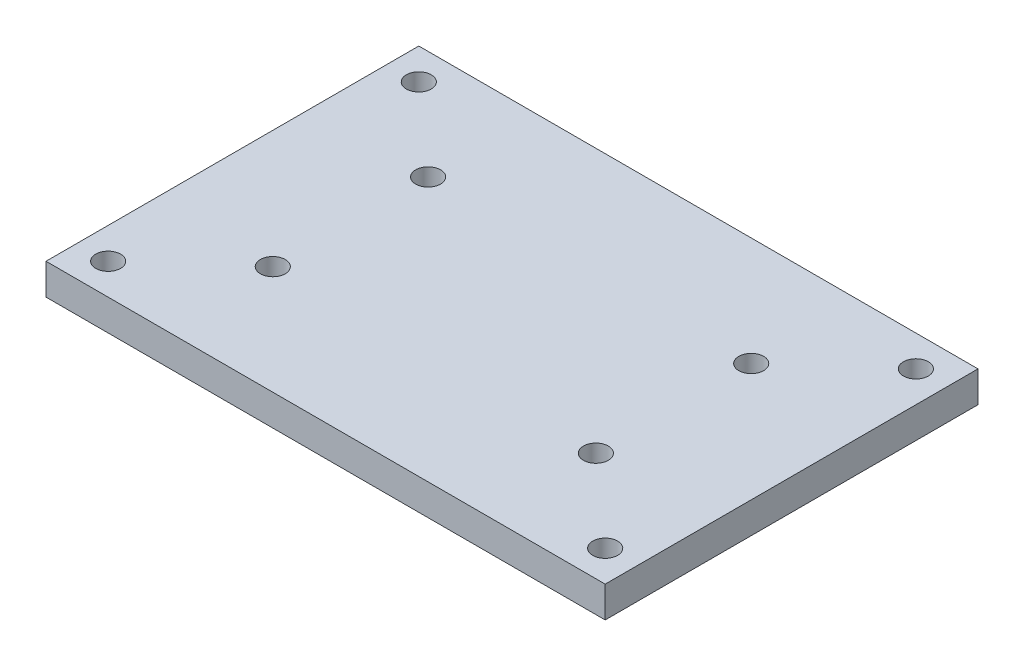
ISO-10303-21;
HEADER;
FILE_DESCRIPTION(('STEP AP214'),'2;1');
FILE_NAME('part.step','',(''),(''),'','','');
FILE_SCHEMA(('AUTOMOTIVE_DESIGN { 1 0 10303 214 1 1 1 1 }'));
ENDSEC;
DATA;
#1=APPLICATION_CONTEXT('core data for automotive mechanical design processes');
#2=APPLICATION_PROTOCOL_DEFINITION('international standard','automotive_design',2000,#1);
#3=PRODUCT_CONTEXT('',#1,'mechanical');
#4=PRODUCT('Part','Part','',(#3));
#5=PRODUCT_RELATED_PRODUCT_CATEGORY('part','',(#4));
#6=PRODUCT_DEFINITION_FORMATION('','',#4);
#7=PRODUCT_DEFINITION_CONTEXT('part definition',#1,'design');
#8=PRODUCT_DEFINITION('design','',#6,#7);
#9=PRODUCT_DEFINITION_SHAPE('','',#8);
#10=(LENGTH_UNIT() NAMED_UNIT(*) SI_UNIT(.MILLI.,.METRE.));
#11=(NAMED_UNIT(*) PLANE_ANGLE_UNIT() SI_UNIT($,.RADIAN.));
#12=(NAMED_UNIT(*) SI_UNIT($,.STERADIAN.) SOLID_ANGLE_UNIT());
#13=UNCERTAINTY_MEASURE_WITH_UNIT(LENGTH_MEASURE(1.E-05),#10,'distance_accuracy_value','');
#14=(GEOMETRIC_REPRESENTATION_CONTEXT(3) GLOBAL_UNCERTAINTY_ASSIGNED_CONTEXT((#13)) GLOBAL_UNIT_ASSIGNED_CONTEXT((#10,
#11,#12)) REPRESENTATION_CONTEXT('',''));
#15=CARTESIAN_POINT('',(0.,0.,0.));
#16=DIRECTION('',(0.,0.,1.));
#17=DIRECTION('',(1.,0.,0.));
#18=AXIS2_PLACEMENT_3D('',#15,#16,#17);
#19=CARTESIAN_POINT('',(0.,5.,0.));
#20=DIRECTION('',(0.,1.,0.));
#21=DIRECTION('',(0.,0.,1.));
#22=AXIS2_PLACEMENT_3D('',#19,#20,#21);
#23=PLANE('',#22);
#24=CARTESIAN_POINT('',(26.,5.,12.5));
#25=DIRECTION('',(0.,1.,0.));
#26=DIRECTION('',(0.,0.,1.));
#27=AXIS2_PLACEMENT_3D('',#24,#25,#26);
#28=CIRCLE('',#27,2.);
#29=CARTESIAN_POINT('',(26.,5.,14.5));
#30=VERTEX_POINT('',#29);
#31=EDGE_CURVE('E148',#30,#30,#28,.T.);
#32=ORIENTED_EDGE('',*,*,#31,.F.);
#33=EDGE_LOOP('',(#32));
#34=FACE_BOUND('',#33,.T.);
#35=CARTESIAN_POINT('',(-26.,5.,-12.5));
#36=DIRECTION('',(0.,1.,0.));
#37=DIRECTION('',(0.,0.,1.));
#38=AXIS2_PLACEMENT_3D('',#35,#36,#37);
#39=CIRCLE('',#38,2.);
#40=CARTESIAN_POINT('',(-26.,5.,-10.5));
#41=VERTEX_POINT('',#40);
#42=EDGE_CURVE('E136',#41,#41,#39,.T.);
#43=ORIENTED_EDGE('',*,*,#42,.F.);
#44=EDGE_LOOP('',(#43));
#45=FACE_BOUND('',#44,.T.);
#46=CARTESIAN_POINT('',(40.,5.,25.));
#47=DIRECTION('',(0.,1.,0.));
#48=DIRECTION('',(0.,0.,-1.));
#49=AXIS2_PLACEMENT_3D('',#46,#47,#48);
#50=CIRCLE('',#49,2.);
#51=CARTESIAN_POINT('',(40.,5.,23.));
#52=VERTEX_POINT('',#51);
#53=EDGE_CURVE('E124',#52,#52,#50,.T.);
#54=ORIENTED_EDGE('',*,*,#53,.F.);
#55=EDGE_LOOP('',(#54));
#56=FACE_BOUND('',#55,.T.);
#57=CARTESIAN_POINT('',(-40.,5.,-25.));
#58=DIRECTION('',(0.,1.,0.));
#59=DIRECTION('',(0.,0.,1.));
#60=AXIS2_PLACEMENT_3D('',#57,#58,#59);
#61=CIRCLE('',#60,2.);
#62=CARTESIAN_POINT('',(-40.,5.,-23.));
#63=VERTEX_POINT('',#62);
#64=EDGE_CURVE('E103',#63,#63,#61,.T.);
#65=ORIENTED_EDGE('',*,*,#64,.F.);
#66=EDGE_LOOP('',(#65));
#67=FACE_BOUND('',#66,.T.);
#68=DIRECTION('',(0.,0.,1.));
#69=VECTOR('',#68,1.);
#70=CARTESIAN_POINT('',(-45.,5.,30.));
#71=LINE('',#70,#69);
#72=CARTESIAN_POINT('',(-45.,5.,-30.));
#73=VERTEX_POINT('',#72);
#74=CARTESIAN_POINT('',(-45.,5.,30.));
#75=VERTEX_POINT('',#74);
#76=EDGE_CURVE('E88',#73,#75,#71,.T.);
#77=ORIENTED_EDGE('',*,*,#76,.T.);
#78=DIRECTION('',(1.,0.,0.));
#79=VECTOR('',#78,1.);
#80=CARTESIAN_POINT('',(45.,5.,30.));
#81=LINE('',#80,#79);
#82=CARTESIAN_POINT('',(45.,5.,30.));
#83=VERTEX_POINT('',#82);
#84=EDGE_CURVE('E83',#75,#83,#81,.T.);
#85=ORIENTED_EDGE('',*,*,#84,.T.);
#86=DIRECTION('',(0.,0.,-1.));
#87=VECTOR('',#86,1.);
#88=CARTESIAN_POINT('',(45.,5.,30.));
#89=LINE('',#88,#87);
#90=CARTESIAN_POINT('',(45.,5.,-30.));
#91=VERTEX_POINT('',#90);
#92=EDGE_CURVE('E86',#83,#91,#89,.T.);
#93=ORIENTED_EDGE('',*,*,#92,.T.);
#94=DIRECTION('',(-1.,0.,0.));
#95=VECTOR('',#94,1.);
#96=CARTESIAN_POINT('',(45.,5.,-30.));
#97=LINE('',#96,#95);
#98=EDGE_CURVE('E53',#91,#73,#97,.T.);
#99=ORIENTED_EDGE('',*,*,#98,.T.);
#100=EDGE_LOOP('',(#77,#85,#93,#99));
#101=FACE_BOUND('',#100,.T.);
#102=CARTESIAN_POINT('',(40.,5.,-25.));
#103=DIRECTION('',(0.,1.,0.));
#104=DIRECTION('',(0.,0.,1.));
#105=AXIS2_PLACEMENT_3D('',#102,#103,#104);
#106=CIRCLE('',#105,2.);
#107=CARTESIAN_POINT('',(40.,5.,-23.));
#108=VERTEX_POINT('',#107);
#109=EDGE_CURVE('E118',#108,#108,#106,.T.);
#110=ORIENTED_EDGE('',*,*,#109,.F.);
#111=EDGE_LOOP('',(#110));
#112=FACE_BOUND('',#111,.T.);
#113=CARTESIAN_POINT('',(-40.,5.,25.));
#114=DIRECTION('',(0.,1.,0.));
#115=DIRECTION('',(0.,0.,-1.));
#116=AXIS2_PLACEMENT_3D('',#113,#114,#115);
#117=CIRCLE('',#116,2.);
#118=CARTESIAN_POINT('',(-40.,5.,23.));
#119=VERTEX_POINT('',#118);
#120=EDGE_CURVE('E130',#119,#119,#117,.T.);
#121=ORIENTED_EDGE('',*,*,#120,.F.);
#122=EDGE_LOOP('',(#121));
#123=FACE_BOUND('',#122,.T.);
#124=CARTESIAN_POINT('',(26.,5.,-12.5));
#125=DIRECTION('',(0.,1.,0.));
#126=DIRECTION('',(0.,0.,-1.));
#127=AXIS2_PLACEMENT_3D('',#124,#125,#126);
#128=CIRCLE('',#127,2.);
#129=CARTESIAN_POINT('',(26.,5.,-14.5));
#130=VERTEX_POINT('',#129);
#131=EDGE_CURVE('E142',#130,#130,#128,.T.);
#132=ORIENTED_EDGE('',*,*,#131,.F.);
#133=EDGE_LOOP('',(#132));
#134=FACE_BOUND('',#133,.T.);
#135=CARTESIAN_POINT('',(-26.,5.,12.5));
#136=DIRECTION('',(0.,1.,0.));
#137=DIRECTION('',(0.,0.,-1.));
#138=AXIS2_PLACEMENT_3D('',#135,#136,#137);
#139=CIRCLE('',#138,2.);
#140=CARTESIAN_POINT('',(-26.,5.,10.5));
#141=VERTEX_POINT('',#140);
#142=EDGE_CURVE('E154',#141,#141,#139,.T.);
#143=ORIENTED_EDGE('',*,*,#142,.F.);
#144=EDGE_LOOP('',(#143));
#145=FACE_BOUND('',#144,.T.);
#146=ADVANCED_FACE('F36',(#34,#45,#56,#67,#101,#112,#123,#134,#145),#23,.T.);
#147=CARTESIAN_POINT('',(0.,0.,0.));
#148=DIRECTION('',(0.,1.,0.));
#149=DIRECTION('',(0.,0.,1.));
#150=AXIS2_PLACEMENT_3D('',#147,#148,#149);
#151=PLANE('',#150);
#152=DIRECTION('',(0.,0.,1.));
#153=VECTOR('',#152,1.);
#154=CARTESIAN_POINT('',(-45.,0.,30.));
#155=LINE('',#154,#153);
#156=CARTESIAN_POINT('',(-45.,0.,-30.));
#157=VERTEX_POINT('',#156);
#158=CARTESIAN_POINT('',(-45.,0.,30.));
#159=VERTEX_POINT('',#158);
#160=EDGE_CURVE('E100',#157,#159,#155,.T.);
#161=ORIENTED_EDGE('',*,*,#160,.F.);
#162=DIRECTION('',(-1.,0.,0.));
#163=VECTOR('',#162,1.);
#164=CARTESIAN_POINT('',(45.,0.,-30.));
#165=LINE('',#164,#163);
#166=CARTESIAN_POINT('',(45.,0.,-30.));
#167=VERTEX_POINT('',#166);
#168=EDGE_CURVE('E76',#167,#157,#165,.T.);
#169=ORIENTED_EDGE('',*,*,#168,.F.);
#170=DIRECTION('',(0.,0.,-1.));
#171=VECTOR('',#170,1.);
#172=CARTESIAN_POINT('',(45.,0.,30.));
#173=LINE('',#172,#171);
#174=CARTESIAN_POINT('',(45.,0.,30.));
#175=VERTEX_POINT('',#174);
#176=EDGE_CURVE('E70',#175,#167,#173,.T.);
#177=ORIENTED_EDGE('',*,*,#176,.F.);
#178=DIRECTION('',(1.,0.,0.));
#179=VECTOR('',#178,1.);
#180=CARTESIAN_POINT('',(45.,0.,30.));
#181=LINE('',#180,#179);
#182=EDGE_CURVE('E92',#159,#175,#181,.T.);
#183=ORIENTED_EDGE('',*,*,#182,.F.);
#184=EDGE_LOOP('',(#161,#169,#177,#183));
#185=FACE_BOUND('',#184,.T.);
#186=CARTESIAN_POINT('',(-40.,0.,-25.));
#187=DIRECTION('',(0.,1.,0.));
#188=DIRECTION('',(0.,0.,1.));
#189=AXIS2_PLACEMENT_3D('',#186,#187,#188);
#190=CIRCLE('',#189,2.);
#191=CARTESIAN_POINT('',(-40.,0.,-23.));
#192=VERTEX_POINT('',#191);
#193=EDGE_CURVE('E115',#192,#192,#190,.T.);
#194=ORIENTED_EDGE('',*,*,#193,.T.);
#195=EDGE_LOOP('',(#194));
#196=FACE_BOUND('',#195,.T.);
#197=CARTESIAN_POINT('',(40.,0.,-25.));
#198=DIRECTION('',(0.,1.,0.));
#199=DIRECTION('',(0.,0.,1.));
#200=AXIS2_PLACEMENT_3D('',#197,#198,#199);
#201=CIRCLE('',#200,2.);
#202=CARTESIAN_POINT('',(40.,0.,-23.));
#203=VERTEX_POINT('',#202);
#204=EDGE_CURVE('E121',#203,#203,#201,.T.);
#205=ORIENTED_EDGE('',*,*,#204,.T.);
#206=EDGE_LOOP('',(#205));
#207=FACE_BOUND('',#206,.T.);
#208=CARTESIAN_POINT('',(40.,0.,25.));
#209=DIRECTION('',(0.,1.,0.));
#210=DIRECTION('',(0.,0.,-1.));
#211=AXIS2_PLACEMENT_3D('',#208,#209,#210);
#212=CIRCLE('',#211,2.);
#213=CARTESIAN_POINT('',(40.,0.,23.));
#214=VERTEX_POINT('',#213);
#215=EDGE_CURVE('E127',#214,#214,#212,.T.);
#216=ORIENTED_EDGE('',*,*,#215,.T.);
#217=EDGE_LOOP('',(#216));
#218=FACE_BOUND('',#217,.T.);
#219=CARTESIAN_POINT('',(-40.,0.,25.));
#220=DIRECTION('',(0.,1.,0.));
#221=DIRECTION('',(0.,0.,-1.));
#222=AXIS2_PLACEMENT_3D('',#219,#220,#221);
#223=CIRCLE('',#222,2.);
#224=CARTESIAN_POINT('',(-40.,0.,23.));
#225=VERTEX_POINT('',#224);
#226=EDGE_CURVE('E133',#225,#225,#223,.T.);
#227=ORIENTED_EDGE('',*,*,#226,.T.);
#228=EDGE_LOOP('',(#227));
#229=FACE_BOUND('',#228,.T.);
#230=CARTESIAN_POINT('',(-26.,0.,-12.5));
#231=DIRECTION('',(0.,1.,0.));
#232=DIRECTION('',(0.,0.,1.));
#233=AXIS2_PLACEMENT_3D('',#230,#231,#232);
#234=CIRCLE('',#233,2.);
#235=CARTESIAN_POINT('',(-26.,0.,-10.5));
#236=VERTEX_POINT('',#235);
#237=EDGE_CURVE('E139',#236,#236,#234,.T.);
#238=ORIENTED_EDGE('',*,*,#237,.T.);
#239=EDGE_LOOP('',(#238));
#240=FACE_BOUND('',#239,.T.);
#241=CARTESIAN_POINT('',(26.,0.,-12.5));
#242=DIRECTION('',(0.,1.,0.));
#243=DIRECTION('',(0.,0.,-1.));
#244=AXIS2_PLACEMENT_3D('',#241,#242,#243);
#245=CIRCLE('',#244,2.);
#246=CARTESIAN_POINT('',(26.,0.,-14.5));
#247=VERTEX_POINT('',#246);
#248=EDGE_CURVE('E145',#247,#247,#245,.T.);
#249=ORIENTED_EDGE('',*,*,#248,.T.);
#250=EDGE_LOOP('',(#249));
#251=FACE_BOUND('',#250,.T.);
#252=CARTESIAN_POINT('',(26.,0.,12.5));
#253=DIRECTION('',(0.,1.,0.));
#254=DIRECTION('',(0.,0.,1.));
#255=AXIS2_PLACEMENT_3D('',#252,#253,#254);
#256=CIRCLE('',#255,2.);
#257=CARTESIAN_POINT('',(26.,0.,14.5));
#258=VERTEX_POINT('',#257);
#259=EDGE_CURVE('E151',#258,#258,#256,.T.);
#260=ORIENTED_EDGE('',*,*,#259,.T.);
#261=EDGE_LOOP('',(#260));
#262=FACE_BOUND('',#261,.T.);
#263=CARTESIAN_POINT('',(-26.,0.,12.5));
#264=DIRECTION('',(0.,1.,0.));
#265=DIRECTION('',(0.,0.,-1.));
#266=AXIS2_PLACEMENT_3D('',#263,#264,#265);
#267=CIRCLE('',#266,2.);
#268=CARTESIAN_POINT('',(-26.,0.,10.5));
#269=VERTEX_POINT('',#268);
#270=EDGE_CURVE('E157',#269,#269,#267,.T.);
#271=ORIENTED_EDGE('',*,*,#270,.T.);
#272=EDGE_LOOP('',(#271));
#273=FACE_BOUND('',#272,.T.);
#274=ADVANCED_FACE('F111',(#185,#196,#207,#218,#229,#240,#251,#262,#273),#151,.F.);
#275=CARTESIAN_POINT('',(-45.,5.,30.));
#276=DIRECTION('',(1.,0.,0.));
#277=DIRECTION('',(0.,0.,-1.));
#278=AXIS2_PLACEMENT_3D('',#275,#276,#277);
#279=PLANE('',#278);
#280=ORIENTED_EDGE('',*,*,#160,.T.);
#281=DIRECTION('',(0.,-1.,0.));
#282=VECTOR('',#281,1.);
#283=CARTESIAN_POINT('',(-45.,5.,30.));
#284=LINE('',#283,#282);
#285=EDGE_CURVE('E11',#75,#159,#284,.T.);
#286=ORIENTED_EDGE('',*,*,#285,.F.);
#287=ORIENTED_EDGE('',*,*,#76,.F.);
#288=DIRECTION('',(0.,-1.,0.));
#289=VECTOR('',#288,1.);
#290=CARTESIAN_POINT('',(-45.,5.,-30.));
#291=LINE('',#290,#289);
#292=EDGE_CURVE('E96',#73,#157,#291,.T.);
#293=ORIENTED_EDGE('',*,*,#292,.T.);
#294=EDGE_LOOP('',(#280,#286,#287,#293));
#295=FACE_BOUND('',#294,.T.);
#296=ADVANCED_FACE('F38',(#295),#279,.F.);
#297=CARTESIAN_POINT('',(45.,5.,30.));
#298=DIRECTION('',(0.,0.,-1.));
#299=DIRECTION('',(-1.,0.,0.));
#300=AXIS2_PLACEMENT_3D('',#297,#298,#299);
#301=PLANE('',#300);
#302=ORIENTED_EDGE('',*,*,#182,.T.);
#303=DIRECTION('',(0.,-1.,0.));
#304=VECTOR('',#303,1.);
#305=CARTESIAN_POINT('',(45.,5.,30.));
#306=LINE('',#305,#304);
#307=EDGE_CURVE('E45',#83,#175,#306,.T.);
#308=ORIENTED_EDGE('',*,*,#307,.F.);
#309=ORIENTED_EDGE('',*,*,#84,.F.);
#310=ORIENTED_EDGE('',*,*,#285,.T.);
#311=EDGE_LOOP('',(#302,#308,#309,#310));
#312=FACE_BOUND('',#311,.T.);
#313=ADVANCED_FACE('F91',(#312),#301,.F.);
#314=CARTESIAN_POINT('',(45.,5.,30.));
#315=DIRECTION('',(-1.,0.,0.));
#316=DIRECTION('',(0.,0.,1.));
#317=AXIS2_PLACEMENT_3D('',#314,#315,#316);
#318=PLANE('',#317);
#319=ORIENTED_EDGE('',*,*,#176,.T.);
#320=DIRECTION('',(0.,-1.,0.));
#321=VECTOR('',#320,1.);
#322=CARTESIAN_POINT('',(45.,5.,-30.));
#323=LINE('',#322,#321);
#324=EDGE_CURVE('E93',#91,#167,#323,.T.);
#325=ORIENTED_EDGE('',*,*,#324,.F.);
#326=ORIENTED_EDGE('',*,*,#92,.F.);
#327=ORIENTED_EDGE('',*,*,#307,.T.);
#328=EDGE_LOOP('',(#319,#325,#326,#327));
#329=FACE_BOUND('',#328,.T.);
#330=ADVANCED_FACE('F94',(#329),#318,.F.);
#331=CARTESIAN_POINT('',(45.,5.,-30.));
#332=DIRECTION('',(0.,0.,1.));
#333=DIRECTION('',(1.,0.,0.));
#334=AXIS2_PLACEMENT_3D('',#331,#332,#333);
#335=PLANE('',#334);
#336=ORIENTED_EDGE('',*,*,#168,.T.);
#337=ORIENTED_EDGE('',*,*,#292,.F.);
#338=ORIENTED_EDGE('',*,*,#98,.F.);
#339=ORIENTED_EDGE('',*,*,#324,.T.);
#340=EDGE_LOOP('',(#336,#337,#338,#339));
#341=FACE_BOUND('',#340,.T.);
#342=ADVANCED_FACE('F108',(#341),#335,.F.);
#343=CARTESIAN_POINT('',(-40.,5.,-25.));
#344=DIRECTION('',(0.,-1.,0.));
#345=DIRECTION('',(0.,0.,-1.));
#346=AXIS2_PLACEMENT_3D('',#343,#344,#345);
#347=CYLINDRICAL_SURFACE('',#346,2.);
#348=ORIENTED_EDGE('',*,*,#64,.T.);
#349=EDGE_LOOP('',(#348));
#350=FACE_BOUND('',#349,.T.);
#351=ORIENTED_EDGE('',*,*,#193,.F.);
#352=EDGE_LOOP('',(#351));
#353=FACE_BOUND('',#352,.T.);
#354=ADVANCED_FACE('F176',(#350,#353),#347,.F.);
#355=CARTESIAN_POINT('',(40.,5.,-25.));
#356=DIRECTION('',(0.,-1.,0.));
#357=DIRECTION('',(0.,0.,-1.));
#358=AXIS2_PLACEMENT_3D('',#355,#356,#357);
#359=CYLINDRICAL_SURFACE('',#358,2.);
#360=ORIENTED_EDGE('',*,*,#109,.T.);
#361=EDGE_LOOP('',(#360));
#362=FACE_BOUND('',#361,.T.);
#363=ORIENTED_EDGE('',*,*,#204,.F.);
#364=EDGE_LOOP('',(#363));
#365=FACE_BOUND('',#364,.T.);
#366=ADVANCED_FACE('F224',(#362,#365),#359,.F.);
#367=CARTESIAN_POINT('',(40.,5.,25.));
#368=DIRECTION('',(0.,-1.,0.));
#369=DIRECTION('',(0.,0.,-1.));
#370=AXIS2_PLACEMENT_3D('',#367,#368,#369);
#371=CYLINDRICAL_SURFACE('',#370,2.);
#372=ORIENTED_EDGE('',*,*,#53,.T.);
#373=EDGE_LOOP('',(#372));
#374=FACE_BOUND('',#373,.T.);
#375=ORIENTED_EDGE('',*,*,#215,.F.);
#376=EDGE_LOOP('',(#375));
#377=FACE_BOUND('',#376,.T.);
#378=ADVANCED_FACE('F232',(#374,#377),#371,.F.);
#379=CARTESIAN_POINT('',(-40.,5.,25.));
#380=DIRECTION('',(0.,-1.,0.));
#381=DIRECTION('',(0.,0.,-1.));
#382=AXIS2_PLACEMENT_3D('',#379,#380,#381);
#383=CYLINDRICAL_SURFACE('',#382,2.);
#384=ORIENTED_EDGE('',*,*,#120,.T.);
#385=EDGE_LOOP('',(#384));
#386=FACE_BOUND('',#385,.T.);
#387=ORIENTED_EDGE('',*,*,#226,.F.);
#388=EDGE_LOOP('',(#387));
#389=FACE_BOUND('',#388,.T.);
#390=ADVANCED_FACE('F240',(#386,#389),#383,.F.);
#391=CARTESIAN_POINT('',(-26.,5.,-12.5));
#392=DIRECTION('',(0.,-1.,0.));
#393=DIRECTION('',(0.,0.,-1.));
#394=AXIS2_PLACEMENT_3D('',#391,#392,#393);
#395=CYLINDRICAL_SURFACE('',#394,2.);
#396=ORIENTED_EDGE('',*,*,#42,.T.);
#397=EDGE_LOOP('',(#396));
#398=FACE_BOUND('',#397,.T.);
#399=ORIENTED_EDGE('',*,*,#237,.F.);
#400=EDGE_LOOP('',(#399));
#401=FACE_BOUND('',#400,.T.);
#402=ADVANCED_FACE('F249',(#398,#401),#395,.F.);
#403=CARTESIAN_POINT('',(26.,5.,-12.5));
#404=DIRECTION('',(0.,-1.,0.));
#405=DIRECTION('',(0.,0.,-1.));
#406=AXIS2_PLACEMENT_3D('',#403,#404,#405);
#407=CYLINDRICAL_SURFACE('',#406,2.);
#408=ORIENTED_EDGE('',*,*,#131,.T.);
#409=EDGE_LOOP('',(#408));
#410=FACE_BOUND('',#409,.T.);
#411=ORIENTED_EDGE('',*,*,#248,.F.);
#412=EDGE_LOOP('',(#411));
#413=FACE_BOUND('',#412,.T.);
#414=ADVANCED_FACE('F258',(#410,#413),#407,.F.);
#415=CARTESIAN_POINT('',(26.,5.,12.5));
#416=DIRECTION('',(0.,-1.,0.));
#417=DIRECTION('',(0.,0.,-1.));
#418=AXIS2_PLACEMENT_3D('',#415,#416,#417);
#419=CYLINDRICAL_SURFACE('',#418,2.);
#420=ORIENTED_EDGE('',*,*,#31,.T.);
#421=EDGE_LOOP('',(#420));
#422=FACE_BOUND('',#421,.T.);
#423=ORIENTED_EDGE('',*,*,#259,.F.);
#424=EDGE_LOOP('',(#423));
#425=FACE_BOUND('',#424,.T.);
#426=ADVANCED_FACE('F267',(#422,#425),#419,.F.);
#427=CARTESIAN_POINT('',(-26.,5.,12.5));
#428=DIRECTION('',(0.,-1.,0.));
#429=DIRECTION('',(0.,0.,-1.));
#430=AXIS2_PLACEMENT_3D('',#427,#428,#429);
#431=CYLINDRICAL_SURFACE('',#430,2.);
#432=ORIENTED_EDGE('',*,*,#142,.T.);
#433=EDGE_LOOP('',(#432));
#434=FACE_BOUND('',#433,.T.);
#435=ORIENTED_EDGE('',*,*,#270,.F.);
#436=EDGE_LOOP('',(#435));
#437=FACE_BOUND('',#436,.T.);
#438=ADVANCED_FACE('F163',(#434,#437),#431,.F.);
#439=CLOSED_SHELL('',(#146,#274,#296,#313,#330,#342,#354,#366,#378,#390,#402,#414,#426,#438));
#440=MANIFOLD_SOLID_BREP('B2',#439);
#441=ADVANCED_BREP_SHAPE_REPRESENTATION('',(#18,#440),#14);
#442=SHAPE_DEFINITION_REPRESENTATION(#9,#441);
ENDSEC;
END-ISO-10303-21;
